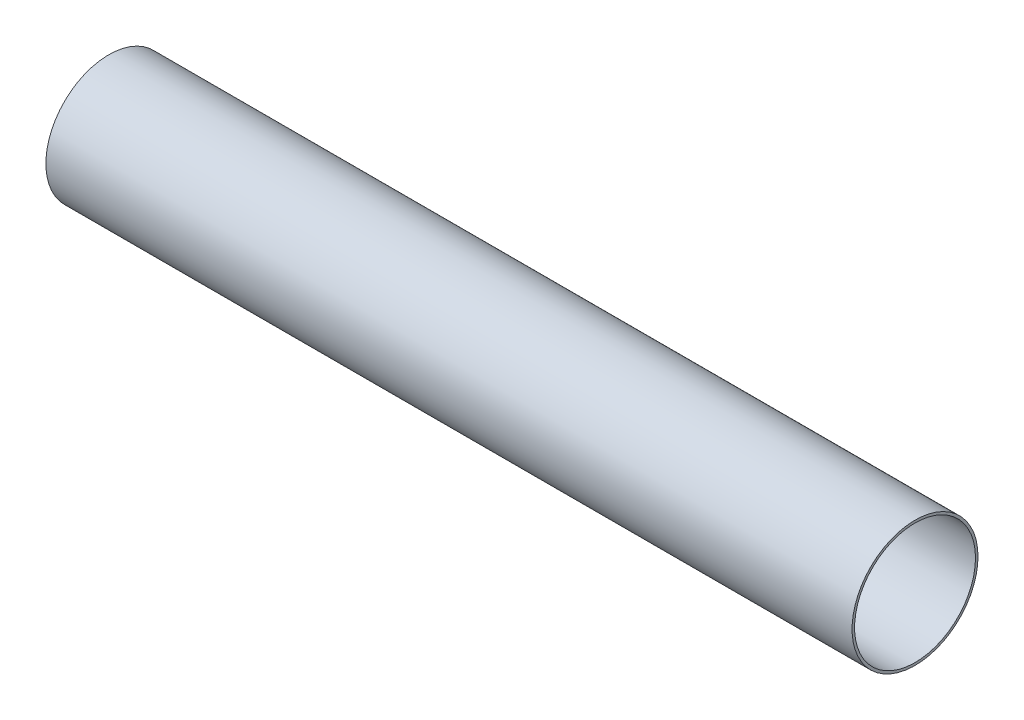
ISO-10303-21;
HEADER;
FILE_DESCRIPTION(('STEP AP214'),'2;1');
FILE_NAME('part.step','',(''),(''),'','','');
FILE_SCHEMA(('AUTOMOTIVE_DESIGN { 1 0 10303 214 1 1 1 1 }'));
ENDSEC;
DATA;
#1=APPLICATION_CONTEXT('core data for automotive mechanical design processes');
#2=APPLICATION_PROTOCOL_DEFINITION('international standard','automotive_design',2000,#1);
#3=PRODUCT_CONTEXT('',#1,'mechanical');
#4=PRODUCT('Part','Part','',(#3));
#5=PRODUCT_RELATED_PRODUCT_CATEGORY('part','',(#4));
#6=PRODUCT_DEFINITION_FORMATION('','',#4);
#7=PRODUCT_DEFINITION_CONTEXT('part definition',#1,'design');
#8=PRODUCT_DEFINITION('design','',#6,#7);
#9=PRODUCT_DEFINITION_SHAPE('','',#8);
#10=(LENGTH_UNIT() NAMED_UNIT(*) SI_UNIT(.MILLI.,.METRE.));
#11=(NAMED_UNIT(*) PLANE_ANGLE_UNIT() SI_UNIT($,.RADIAN.));
#12=(NAMED_UNIT(*) SI_UNIT($,.STERADIAN.) SOLID_ANGLE_UNIT());
#13=UNCERTAINTY_MEASURE_WITH_UNIT(LENGTH_MEASURE(1.E-05),#10,'distance_accuracy_value','');
#14=(GEOMETRIC_REPRESENTATION_CONTEXT(3) GLOBAL_UNCERTAINTY_ASSIGNED_CONTEXT((#13)) GLOBAL_UNIT_ASSIGNED_CONTEXT((#10,
#11,#12)) REPRESENTATION_CONTEXT('',''));
#15=CARTESIAN_POINT('',(0.,0.,0.));
#16=DIRECTION('',(0.,0.,1.));
#17=DIRECTION('',(1.,0.,0.));
#18=AXIS2_PLACEMENT_3D('',#15,#16,#17);
#19=CARTESIAN_POINT('',(508.,0.,0.));
#20=DIRECTION('',(1.,0.,0.));
#21=DIRECTION('',(0.,0.,-1.));
#22=AXIS2_PLACEMENT_3D('',#19,#20,#21);
#23=PLANE('',#22);
#24=CARTESIAN_POINT('',(508.,0.,0.));
#25=DIRECTION('',(1.,0.,0.));
#26=DIRECTION('',(0.,0.,-1.));
#27=AXIS2_PLACEMENT_3D('',#24,#25,#26);
#28=CIRCLE('',#27,39.6748);
#29=CARTESIAN_POINT('',(508.,0.,-39.6748));
#30=VERTEX_POINT('',#29);
#31=EDGE_CURVE('E10',#30,#30,#28,.T.);
#32=ORIENTED_EDGE('',*,*,#31,.T.);
#33=EDGE_LOOP('',(#32));
#34=FACE_BOUND('',#33,.T.);
#35=CARTESIAN_POINT('',(508.,0.,0.));
#36=DIRECTION('',(1.,0.,0.));
#37=DIRECTION('',(0.,0.,-1.));
#38=AXIS2_PLACEMENT_3D('',#35,#36,#37);
#39=CIRCLE('',#38,38.1);
#40=CARTESIAN_POINT('',(508.,0.,-38.1));
#41=VERTEX_POINT('',#40);
#42=EDGE_CURVE('E54',#41,#41,#39,.T.);
#43=ORIENTED_EDGE('',*,*,#42,.F.);
#44=EDGE_LOOP('',(#43));
#45=FACE_BOUND('',#44,.T.);
#46=ADVANCED_FACE('F41',(#34,#45),#23,.T.);
#47=CARTESIAN_POINT('',(0.,0.,0.));
#48=DIRECTION('',(1.,0.,0.));
#49=DIRECTION('',(0.,0.,-1.));
#50=AXIS2_PLACEMENT_3D('',#47,#48,#49);
#51=PLANE('',#50);
#52=CARTESIAN_POINT('',(0.,0.,0.));
#53=DIRECTION('',(1.,0.,0.));
#54=DIRECTION('',(0.,0.,-1.));
#55=AXIS2_PLACEMENT_3D('',#52,#53,#54);
#56=CIRCLE('',#55,39.6748);
#57=CARTESIAN_POINT('',(0.,0.,-39.6748));
#58=VERTEX_POINT('',#57);
#59=EDGE_CURVE('E45',#58,#58,#56,.T.);
#60=ORIENTED_EDGE('',*,*,#59,.F.);
#61=EDGE_LOOP('',(#60));
#62=FACE_BOUND('',#61,.T.);
#63=CARTESIAN_POINT('',(0.,0.,0.));
#64=DIRECTION('',(1.,0.,0.));
#65=DIRECTION('',(0.,0.,-1.));
#66=AXIS2_PLACEMENT_3D('',#63,#64,#65);
#67=CIRCLE('',#66,38.1);
#68=CARTESIAN_POINT('',(0.,0.,-38.1));
#69=VERTEX_POINT('',#68);
#70=EDGE_CURVE('E56',#69,#69,#67,.T.);
#71=ORIENTED_EDGE('',*,*,#70,.T.);
#72=EDGE_LOOP('',(#71));
#73=FACE_BOUND('',#72,.T.);
#74=ADVANCED_FACE('F68',(#62,#73),#51,.F.);
#75=CARTESIAN_POINT('',(508.,0.,0.));
#76=DIRECTION('',(-1.,0.,0.));
#77=DIRECTION('',(0.,0.,1.));
#78=AXIS2_PLACEMENT_3D('',#75,#76,#77);
#79=CYLINDRICAL_SURFACE('',#78,39.6748);
#80=ORIENTED_EDGE('',*,*,#31,.F.);
#81=EDGE_LOOP('',(#80));
#82=FACE_BOUND('',#81,.T.);
#83=ORIENTED_EDGE('',*,*,#59,.T.);
#84=EDGE_LOOP('',(#83));
#85=FACE_BOUND('',#84,.T.);
#86=ADVANCED_FACE('F43',(#82,#85),#79,.T.);
#87=CARTESIAN_POINT('',(508.,0.,0.));
#88=DIRECTION('',(-1.,0.,0.));
#89=DIRECTION('',(0.,0.,1.));
#90=AXIS2_PLACEMENT_3D('',#87,#88,#89);
#91=CYLINDRICAL_SURFACE('',#90,38.1);
#92=ORIENTED_EDGE('',*,*,#42,.T.);
#93=EDGE_LOOP('',(#92));
#94=FACE_BOUND('',#93,.T.);
#95=ORIENTED_EDGE('',*,*,#70,.F.);
#96=EDGE_LOOP('',(#95));
#97=FACE_BOUND('',#96,.T.);
#98=ADVANCED_FACE('F64',(#94,#97),#91,.F.);
#99=CLOSED_SHELL('',(#46,#74,#86,#98));
#100=MANIFOLD_SOLID_BREP('B2',#99);
#101=ADVANCED_BREP_SHAPE_REPRESENTATION('',(#18,#100),#14);
#102=SHAPE_DEFINITION_REPRESENTATION(#9,#101);
ENDSEC;
END-ISO-10303-21;
